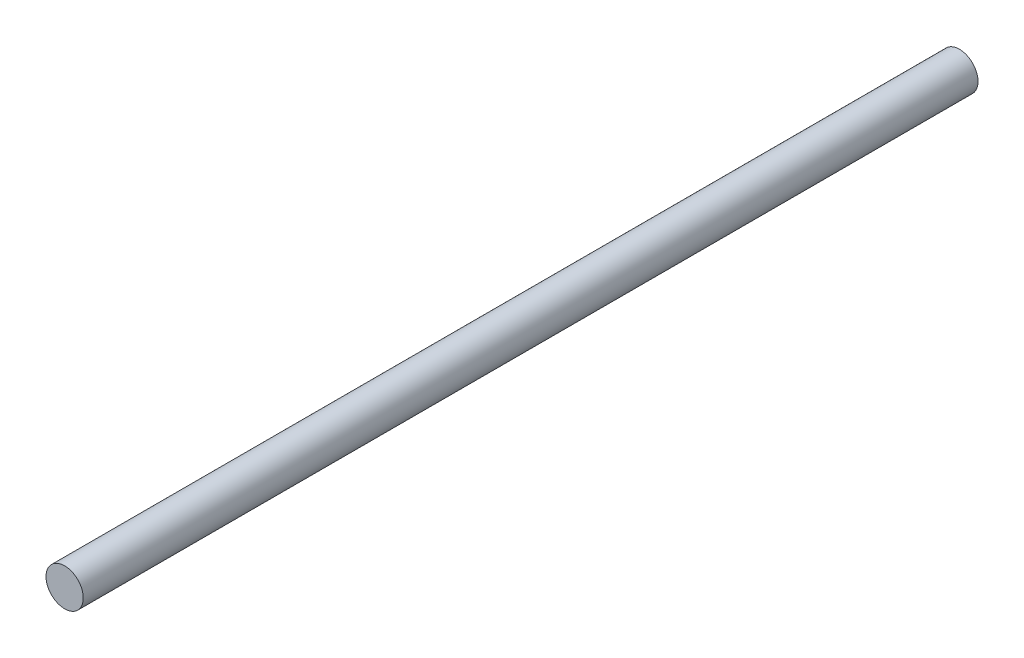
ISO-10303-21;
HEADER;
FILE_DESCRIPTION(('STEP AP214'),'2;1');
FILE_NAME('part.step','',(''),(''),'','','');
FILE_SCHEMA(('AUTOMOTIVE_DESIGN { 1 0 10303 214 1 1 1 1 }'));
ENDSEC;
DATA;
#1=APPLICATION_CONTEXT('core data for automotive mechanical design processes');
#2=APPLICATION_PROTOCOL_DEFINITION('international standard','automotive_design',2000,#1);
#3=PRODUCT_CONTEXT('',#1,'mechanical');
#4=PRODUCT('Part','Part','',(#3));
#5=PRODUCT_RELATED_PRODUCT_CATEGORY('part','',(#4));
#6=PRODUCT_DEFINITION_FORMATION('','',#4);
#7=PRODUCT_DEFINITION_CONTEXT('part definition',#1,'design');
#8=PRODUCT_DEFINITION('design','',#6,#7);
#9=PRODUCT_DEFINITION_SHAPE('','',#8);
#10=(LENGTH_UNIT() NAMED_UNIT(*) SI_UNIT(.MILLI.,.METRE.));
#11=(NAMED_UNIT(*) PLANE_ANGLE_UNIT() SI_UNIT($,.RADIAN.));
#12=(NAMED_UNIT(*) SI_UNIT($,.STERADIAN.) SOLID_ANGLE_UNIT());
#13=UNCERTAINTY_MEASURE_WITH_UNIT(LENGTH_MEASURE(1.E-05),#10,'distance_accuracy_value','');
#14=(GEOMETRIC_REPRESENTATION_CONTEXT(3) GLOBAL_UNCERTAINTY_ASSIGNED_CONTEXT((#13)) GLOBAL_UNIT_ASSIGNED_CONTEXT((#10,
#11,#12)) REPRESENTATION_CONTEXT('',''));
#15=CARTESIAN_POINT('',(0.,0.,0.));
#16=DIRECTION('',(0.,0.,1.));
#17=DIRECTION('',(1.,0.,0.));
#18=AXIS2_PLACEMENT_3D('',#15,#16,#17);
#19=CARTESIAN_POINT('',(0.,0.,304.8));
#20=DIRECTION('',(0.,0.,-1.));
#21=DIRECTION('',(-1.,0.,0.));
#22=AXIS2_PLACEMENT_3D('',#19,#20,#21);
#23=CYLINDRICAL_SURFACE('',#22,6.35);
#24=CARTESIAN_POINT('',(0.,0.,304.8));
#25=DIRECTION('',(0.,0.,1.));
#26=DIRECTION('',(1.,0.,0.));
#27=AXIS2_PLACEMENT_3D('',#24,#25,#26);
#28=CIRCLE('',#27,6.35);
#29=CARTESIAN_POINT('',(-6.35,0.,304.8));
#30=VERTEX_POINT('',#29);
#31=EDGE_CURVE('E10',#30,#30,#28,.T.);
#32=CARTESIAN_POINT('',(0.,0.,0.));
#33=DIRECTION('',(0.,0.,1.));
#34=DIRECTION('',(1.,0.,0.));
#35=AXIS2_PLACEMENT_3D('',#32,#33,#34);
#36=CIRCLE('',#35,6.35);
#37=CARTESIAN_POINT('',(-6.35,0.,0.));
#38=VERTEX_POINT('',#37);
#39=EDGE_CURVE('E40',#38,#38,#36,.T.);
#40=CARTESIAN_POINT('',(-6.35,0.,304.8));
#41=CARTESIAN_POINT('',(-6.35,0.,301.625));
#42=CARTESIAN_POINT('',(-6.35,0.,298.45));
#43=CARTESIAN_POINT('',(-6.35,0.,292.1));
#44=CARTESIAN_POINT('',(-6.35,0.,288.925));
#45=CARTESIAN_POINT('',(-6.35,0.,282.575));
#46=CARTESIAN_POINT('',(-6.35,0.,279.4));
#47=CARTESIAN_POINT('',(-6.35,0.,273.05));
#48=CARTESIAN_POINT('',(-6.35,0.,269.875));
#49=CARTESIAN_POINT('',(-6.35,0.,263.525));
#50=CARTESIAN_POINT('',(-6.35,0.,260.35));
#51=CARTESIAN_POINT('',(-6.35,0.,254.));
#52=CARTESIAN_POINT('',(-6.35,0.,250.825));
#53=CARTESIAN_POINT('',(-6.35,0.,244.475));
#54=CARTESIAN_POINT('',(-6.35,0.,241.3));
#55=CARTESIAN_POINT('',(-6.35,0.,234.95));
#56=CARTESIAN_POINT('',(-6.35,0.,231.775));
#57=CARTESIAN_POINT('',(-6.35,0.,225.425));
#58=CARTESIAN_POINT('',(-6.35,0.,222.25));
#59=CARTESIAN_POINT('',(-6.35,0.,215.9));
#60=CARTESIAN_POINT('',(-6.35,0.,212.725));
#61=CARTESIAN_POINT('',(-6.35,0.,206.375));
#62=CARTESIAN_POINT('',(-6.35,0.,203.2));
#63=CARTESIAN_POINT('',(-6.35,0.,196.85));
#64=CARTESIAN_POINT('',(-6.35,0.,193.675));
#65=CARTESIAN_POINT('',(-6.35,0.,187.325));
#66=CARTESIAN_POINT('',(-6.35,0.,184.15));
#67=CARTESIAN_POINT('',(-6.35,0.,177.8));
#68=CARTESIAN_POINT('',(-6.35,0.,174.625));
#69=CARTESIAN_POINT('',(-6.35,0.,168.275));
#70=CARTESIAN_POINT('',(-6.35,0.,165.1));
#71=CARTESIAN_POINT('',(-6.35,0.,158.75));
#72=CARTESIAN_POINT('',(-6.35,0.,155.575));
#73=CARTESIAN_POINT('',(-6.35,0.,149.225));
#74=CARTESIAN_POINT('',(-6.35,0.,146.05));
#75=CARTESIAN_POINT('',(-6.35,0.,139.7));
#76=CARTESIAN_POINT('',(-6.35,0.,136.525));
#77=CARTESIAN_POINT('',(-6.35,0.,130.175));
#78=CARTESIAN_POINT('',(-6.35,0.,127.));
#79=CARTESIAN_POINT('',(-6.35,0.,120.65));
#80=CARTESIAN_POINT('',(-6.35,0.,117.475));
#81=CARTESIAN_POINT('',(-6.35,0.,111.125));
#82=CARTESIAN_POINT('',(-6.35,0.,107.95));
#83=CARTESIAN_POINT('',(-6.35,0.,101.6));
#84=CARTESIAN_POINT('',(-6.35,0.,98.425));
#85=CARTESIAN_POINT('',(-6.35,0.,92.075));
#86=CARTESIAN_POINT('',(-6.35,0.,88.9));
#87=CARTESIAN_POINT('',(-6.35,0.,82.55));
#88=CARTESIAN_POINT('',(-6.35,0.,79.375));
#89=CARTESIAN_POINT('',(-6.35,0.,73.025));
#90=CARTESIAN_POINT('',(-6.35,0.,69.85));
#91=CARTESIAN_POINT('',(-6.35,0.,63.5));
#92=CARTESIAN_POINT('',(-6.35,0.,60.325));
#93=CARTESIAN_POINT('',(-6.35,0.,53.975));
#94=CARTESIAN_POINT('',(-6.35,0.,50.8));
#95=CARTESIAN_POINT('',(-6.35,0.,44.45));
#96=CARTESIAN_POINT('',(-6.35,0.,41.275));
#97=CARTESIAN_POINT('',(-6.35,0.,34.925));
#98=CARTESIAN_POINT('',(-6.35,0.,31.75));
#99=CARTESIAN_POINT('',(-6.35,0.,25.4));
#100=CARTESIAN_POINT('',(-6.35,0.,22.225));
#101=CARTESIAN_POINT('',(-6.35,0.,15.875));
#102=CARTESIAN_POINT('',(-6.35,0.,12.7));
#103=CARTESIAN_POINT('',(-6.35,0.,6.35));
#104=CARTESIAN_POINT('',(-6.35,0.,3.175));
#105=CARTESIAN_POINT('',(-6.35,0.,0.));
#106=B_SPLINE_CURVE_WITH_KNOTS('',3,(#40,#41,#42,#43,#44,#45,#46,#47,#48,#49,#50,#51,#52,#53,
#54,#55,#56,#57,#58,#59,#60,#61,#62,#63,#64,#65,#66,#67,#68,#69,#70,#71,#72,#73,#74,#75,#76,#77,
#78,#79,#80,#81,#82,#83,#84,#85,#86,#87,#88,#89,#90,#91,#92,#93,#94,#95,#96,#97,#98,#99,#100,
#101,#102,#103,#104,#105),.UNSPECIFIED.,.F.,.F.,(4,2,2,2,2,2,2,2,2,2,2,2,2,2,2,2,2,2,2,2,2,2,2,
2,2,2,2,2,2,2,2,2,4),(0.,9.52500000000001,19.05,28.575,38.1,47.625,57.15,66.675,76.2,
85.7250000000001,95.2500000000001,104.775,114.3,123.825,133.35,142.875,152.4,161.925,171.45,
180.975,190.5,200.025,209.55,219.075,228.6,238.125,247.65,257.175,266.7,276.225,285.75,295.275,
304.8),.UNSPECIFIED.);
#107=EDGE_CURVE('BSEAM37',#30,#38,#106,.T.);
#108=ORIENTED_EDGE('',*,*,#31,.F.);
#109=ORIENTED_EDGE('',*,*,#39,.T.);
#110=ORIENTED_EDGE('',*,*,#107,.T.);
#111=ORIENTED_EDGE('',*,*,#107,.F.);
#112=EDGE_LOOP('',(#108,#110,#109,#111));
#113=FACE_BOUND('',#112,.T.);
#114=ADVANCED_FACE('F37',(#113),#23,.T.);
#115=CARTESIAN_POINT('',(0.,0.,304.8));
#116=DIRECTION('',(0.,0.,1.));
#117=DIRECTION('',(1.,0.,0.));
#118=AXIS2_PLACEMENT_3D('',#115,#116,#117);
#119=PLANE('',#118);
#120=ORIENTED_EDGE('',*,*,#31,.T.);
#121=EDGE_LOOP('',(#120));
#122=FACE_BOUND('',#121,.T.);
#123=ADVANCED_FACE('F52',(#122),#119,.T.);
#124=CARTESIAN_POINT('',(0.,0.,0.));
#125=DIRECTION('',(0.,0.,1.));
#126=DIRECTION('',(1.,0.,0.));
#127=AXIS2_PLACEMENT_3D('',#124,#125,#126);
#128=PLANE('',#127);
#129=ORIENTED_EDGE('',*,*,#39,.F.);
#130=EDGE_LOOP('',(#129));
#131=FACE_BOUND('',#130,.T.);
#132=ADVANCED_FACE('F50',(#131),#128,.F.);
#133=CLOSED_SHELL('',(#114,#123,#132));
#134=MANIFOLD_SOLID_BREP('B2',#133);
#135=ADVANCED_BREP_SHAPE_REPRESENTATION('',(#18,#134),#14);
#136=SHAPE_DEFINITION_REPRESENTATION(#9,#135);
ENDSEC;
END-ISO-10303-21;
